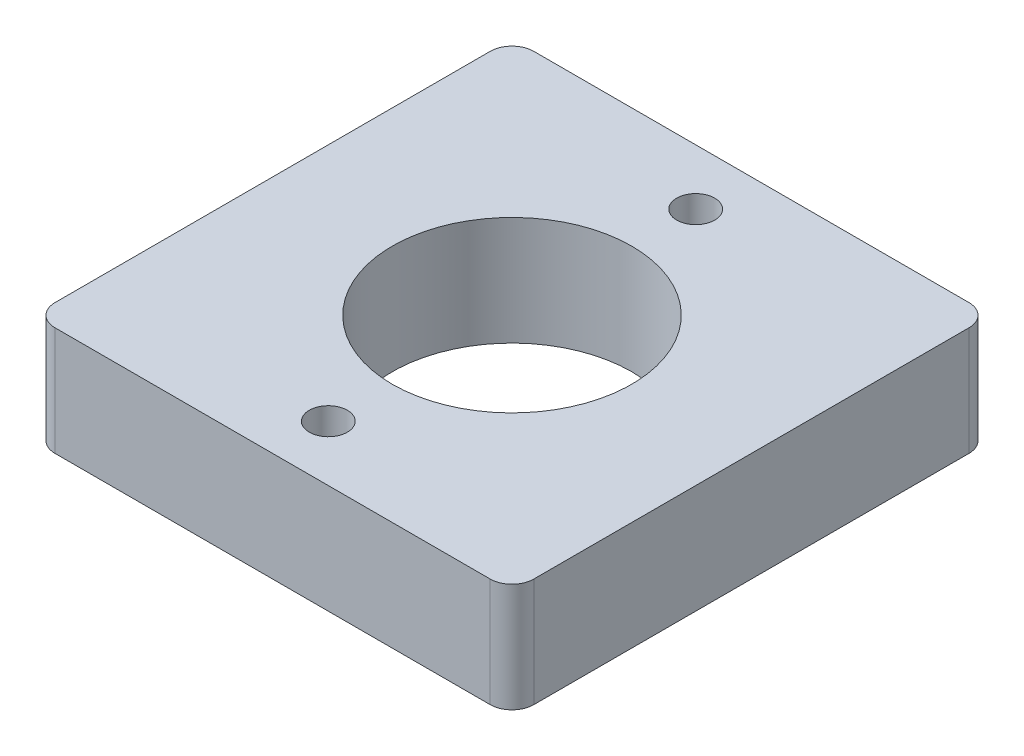
ISO-10303-21;
HEADER;
FILE_DESCRIPTION(('STEP AP214'),'2;1');
FILE_NAME('part.step','',(''),(''),'','','');
FILE_SCHEMA(('AUTOMOTIVE_DESIGN { 1 0 10303 214 1 1 1 1 }'));
ENDSEC;
DATA;
#1=APPLICATION_CONTEXT('core data for automotive mechanical design processes');
#2=APPLICATION_PROTOCOL_DEFINITION('international standard','automotive_design',2000,#1);
#3=PRODUCT_CONTEXT('',#1,'mechanical');
#4=PRODUCT('Part','Part','',(#3));
#5=PRODUCT_RELATED_PRODUCT_CATEGORY('part','',(#4));
#6=PRODUCT_DEFINITION_FORMATION('','',#4);
#7=PRODUCT_DEFINITION_CONTEXT('part definition',#1,'design');
#8=PRODUCT_DEFINITION('design','',#6,#7);
#9=PRODUCT_DEFINITION_SHAPE('','',#8);
#10=(LENGTH_UNIT() NAMED_UNIT(*) SI_UNIT(.MILLI.,.METRE.));
#11=(NAMED_UNIT(*) PLANE_ANGLE_UNIT() SI_UNIT($,.RADIAN.));
#12=(NAMED_UNIT(*) SI_UNIT($,.STERADIAN.) SOLID_ANGLE_UNIT());
#13=UNCERTAINTY_MEASURE_WITH_UNIT(LENGTH_MEASURE(1.E-05),#10,'distance_accuracy_value','');
#14=(GEOMETRIC_REPRESENTATION_CONTEXT(3) GLOBAL_UNCERTAINTY_ASSIGNED_CONTEXT((#13)) GLOBAL_UNIT_ASSIGNED_CONTEXT((#10,
#11,#12)) REPRESENTATION_CONTEXT('',''));
#15=CARTESIAN_POINT('',(0.,0.,0.));
#16=DIRECTION('',(0.,0.,1.));
#17=DIRECTION('',(1.,0.,0.));
#18=AXIS2_PLACEMENT_3D('',#15,#16,#17);
#19=CARTESIAN_POINT('',(0.,10.,0.));
#20=DIRECTION('',(0.,-1.,0.));
#21=DIRECTION('',(0.,0.,-1.));
#22=AXIS2_PLACEMENT_3D('',#19,#20,#21);
#23=PLANE('',#22);
#24=CARTESIAN_POINT('',(0.,10.,-16.88));
#25=DIRECTION('',(0.,1.,0.));
#26=DIRECTION('',(0.,0.,1.));
#27=AXIS2_PLACEMENT_3D('',#24,#25,#26);
#28=CIRCLE('',#27,1.75);
#29=CARTESIAN_POINT('',(0.,10.,-15.13));
#30=VERTEX_POINT('',#29);
#31=EDGE_CURVE('E223',#30,#30,#28,.T.);
#32=ORIENTED_EDGE('',*,*,#31,.F.);
#33=EDGE_LOOP('',(#32));
#34=FACE_BOUND('',#33,.T.);
#35=CARTESIAN_POINT('',(0.,10.,16.88));
#36=DIRECTION('',(0.,1.,0.));
#37=DIRECTION('',(0.,0.,1.));
#38=AXIS2_PLACEMENT_3D('',#35,#36,#37);
#39=CIRCLE('',#38,1.75);
#40=CARTESIAN_POINT('',(0.,10.,18.63));
#41=VERTEX_POINT('',#40);
#42=EDGE_CURVE('E215',#41,#41,#39,.T.);
#43=ORIENTED_EDGE('',*,*,#42,.F.);
#44=EDGE_LOOP('',(#43));
#45=FACE_BOUND('',#44,.T.);
#46=DIRECTION('',(0.,0.,-1.));
#47=VECTOR('',#46,1.);
#48=CARTESIAN_POINT('',(22.,10.,22.));
#49=LINE('',#48,#47);
#50=CARTESIAN_POINT('',(22.,10.,20.));
#51=VERTEX_POINT('',#50);
#52=CARTESIAN_POINT('',(22.,10.,-20.));
#53=VERTEX_POINT('',#52);
#54=EDGE_CURVE('E150',#51,#53,#49,.T.);
#55=ORIENTED_EDGE('',*,*,#54,.T.);
#56=CARTESIAN_POINT('',(20.,10.,-20.));
#57=DIRECTION('',(0.,-1.,0.));
#58=DIRECTION('',(0.,0.,-1.));
#59=AXIS2_PLACEMENT_3D('',#56,#57,#58);
#60=CIRCLE('',#59,2.);
#61=CARTESIAN_POINT('',(20.,10.,-22.));
#62=VERTEX_POINT('',#61);
#63=EDGE_CURVE('E174',#53,#62,#60,.F.);
#64=ORIENTED_EDGE('',*,*,#63,.T.);
#65=DIRECTION('',(-1.,0.,0.));
#66=VECTOR('',#65,1.);
#67=CARTESIAN_POINT('',(-22.,10.,-22.));
#68=LINE('',#67,#66);
#69=CARTESIAN_POINT('',(-20.,10.,-22.));
#70=VERTEX_POINT('',#69);
#71=EDGE_CURVE('E127',#62,#70,#68,.T.);
#72=ORIENTED_EDGE('',*,*,#71,.T.);
#73=CARTESIAN_POINT('',(-20.,10.,-20.));
#74=DIRECTION('',(0.,-1.,0.));
#75=DIRECTION('',(0.,0.,-1.));
#76=AXIS2_PLACEMENT_3D('',#73,#74,#75);
#77=CIRCLE('',#76,2.);
#78=CARTESIAN_POINT('',(-22.,10.,-20.));
#79=VERTEX_POINT('',#78);
#80=EDGE_CURVE('E166',#70,#79,#77,.F.);
#81=ORIENTED_EDGE('',*,*,#80,.T.);
#82=DIRECTION('',(0.,0.,1.));
#83=VECTOR('',#82,1.);
#84=CARTESIAN_POINT('',(-22.,10.,22.));
#85=LINE('',#84,#83);
#86=CARTESIAN_POINT('',(-22.,10.,20.));
#87=VERTEX_POINT('',#86);
#88=EDGE_CURVE('E189',#79,#87,#85,.T.);
#89=ORIENTED_EDGE('',*,*,#88,.T.);
#90=CARTESIAN_POINT('',(-20.,10.,20.));
#91=DIRECTION('',(0.,-1.,0.));
#92=DIRECTION('',(0.,0.,-1.));
#93=AXIS2_PLACEMENT_3D('',#90,#91,#92);
#94=CIRCLE('',#93,2.);
#95=CARTESIAN_POINT('',(-20.,10.,22.));
#96=VERTEX_POINT('',#95);
#97=EDGE_CURVE('E62',#87,#96,#94,.F.);
#98=ORIENTED_EDGE('',*,*,#97,.T.);
#99=DIRECTION('',(1.,0.,0.));
#100=VECTOR('',#99,1.);
#101=CARTESIAN_POINT('',(-22.,10.,22.));
#102=LINE('',#101,#100);
#103=CARTESIAN_POINT('',(20.,10.,22.));
#104=VERTEX_POINT('',#103);
#105=EDGE_CURVE('E152',#96,#104,#102,.T.);
#106=ORIENTED_EDGE('',*,*,#105,.T.);
#107=CARTESIAN_POINT('',(20.,10.,20.));
#108=DIRECTION('',(0.,-1.,0.));
#109=DIRECTION('',(0.,0.,-1.));
#110=AXIS2_PLACEMENT_3D('',#107,#108,#109);
#111=CIRCLE('',#110,2.);
#112=EDGE_CURVE('E171',#104,#51,#111,.F.);
#113=ORIENTED_EDGE('',*,*,#112,.T.);
#114=EDGE_LOOP('',(#55,#64,#72,#81,#89,#98,#106,#113));
#115=FACE_BOUND('',#114,.T.);
#116=CARTESIAN_POINT('',(0.,10.,0.));
#117=DIRECTION('',(0.,1.,0.));
#118=DIRECTION('',(0.,0.,1.));
#119=AXIS2_PLACEMENT_3D('',#116,#117,#118);
#120=CIRCLE('',#119,11.);
#121=CARTESIAN_POINT('',(0.,10.,11.));
#122=VERTEX_POINT('',#121);
#123=EDGE_CURVE('E144',#122,#122,#120,.T.);
#124=ORIENTED_EDGE('',*,*,#123,.F.);
#125=EDGE_LOOP('',(#124));
#126=FACE_BOUND('',#125,.T.);
#127=ADVANCED_FACE('F39',(#34,#45,#115,#126),#23,.F.);
#128=CARTESIAN_POINT('',(0.,0.,0.));
#129=DIRECTION('',(0.,-1.,0.));
#130=DIRECTION('',(0.,0.,-1.));
#131=AXIS2_PLACEMENT_3D('',#128,#129,#130);
#132=PLANE('',#131);
#133=CARTESIAN_POINT('',(0.,0.,-16.88));
#134=DIRECTION('',(0.,1.,0.));
#135=DIRECTION('',(0.,0.,1.));
#136=AXIS2_PLACEMENT_3D('',#133,#134,#135);
#137=CIRCLE('',#136,1.75);
#138=CARTESIAN_POINT('',(0.,0.,-15.13));
#139=VERTEX_POINT('',#138);
#140=EDGE_CURVE('E211',#139,#139,#137,.T.);
#141=ORIENTED_EDGE('',*,*,#140,.T.);
#142=EDGE_LOOP('',(#141));
#143=FACE_BOUND('',#142,.T.);
#144=CARTESIAN_POINT('',(0.,0.,16.88));
#145=DIRECTION('',(0.,1.,0.));
#146=DIRECTION('',(0.,0.,1.));
#147=AXIS2_PLACEMENT_3D('',#144,#145,#146);
#148=CIRCLE('',#147,1.75);
#149=CARTESIAN_POINT('',(0.,0.,18.63));
#150=VERTEX_POINT('',#149);
#151=EDGE_CURVE('E219',#150,#150,#148,.T.);
#152=ORIENTED_EDGE('',*,*,#151,.T.);
#153=EDGE_LOOP('',(#152));
#154=FACE_BOUND('',#153,.T.);
#155=DIRECTION('',(-1.,0.,0.));
#156=VECTOR('',#155,1.);
#157=CARTESIAN_POINT('',(-22.,0.,-22.));
#158=LINE('',#157,#156);
#159=CARTESIAN_POINT('',(20.,0.,-22.));
#160=VERTEX_POINT('',#159);
#161=CARTESIAN_POINT('',(-20.,0.,-22.));
#162=VERTEX_POINT('',#161);
#163=EDGE_CURVE('E124',#160,#162,#158,.T.);
#164=ORIENTED_EDGE('',*,*,#163,.F.);
#165=CARTESIAN_POINT('',(20.,0.,-20.));
#166=DIRECTION('',(0.,-1.,0.));
#167=DIRECTION('',(0.,0.,-1.));
#168=AXIS2_PLACEMENT_3D('',#165,#166,#167);
#169=CIRCLE('',#168,2.);
#170=CARTESIAN_POINT('',(22.,0.,-20.));
#171=VERTEX_POINT('',#170);
#172=EDGE_CURVE('E106',#160,#171,#169,.T.);
#173=ORIENTED_EDGE('',*,*,#172,.T.);
#174=DIRECTION('',(0.,0.,-1.));
#175=VECTOR('',#174,1.);
#176=CARTESIAN_POINT('',(22.,0.,22.));
#177=LINE('',#176,#175);
#178=CARTESIAN_POINT('',(22.,0.,20.));
#179=VERTEX_POINT('',#178);
#180=EDGE_CURVE('E137',#179,#171,#177,.T.);
#181=ORIENTED_EDGE('',*,*,#180,.F.);
#182=CARTESIAN_POINT('',(20.,0.,20.));
#183=DIRECTION('',(0.,-1.,0.));
#184=DIRECTION('',(0.,0.,-1.));
#185=AXIS2_PLACEMENT_3D('',#182,#183,#184);
#186=CIRCLE('',#185,2.);
#187=CARTESIAN_POINT('',(20.,0.,22.));
#188=VERTEX_POINT('',#187);
#189=EDGE_CURVE('E118',#179,#188,#186,.T.);
#190=ORIENTED_EDGE('',*,*,#189,.T.);
#191=DIRECTION('',(1.,0.,0.));
#192=VECTOR('',#191,1.);
#193=CARTESIAN_POINT('',(-22.,0.,22.));
#194=LINE('',#193,#192);
#195=CARTESIAN_POINT('',(-20.,0.,22.));
#196=VERTEX_POINT('',#195);
#197=EDGE_CURVE('E142',#196,#188,#194,.T.);
#198=ORIENTED_EDGE('',*,*,#197,.F.);
#199=CARTESIAN_POINT('',(-20.,0.,20.));
#200=DIRECTION('',(0.,-1.,0.));
#201=DIRECTION('',(0.,0.,-1.));
#202=AXIS2_PLACEMENT_3D('',#199,#200,#201);
#203=CIRCLE('',#202,2.);
#204=CARTESIAN_POINT('',(-22.,0.,20.));
#205=VERTEX_POINT('',#204);
#206=EDGE_CURVE('E156',#196,#205,#203,.T.);
#207=ORIENTED_EDGE('',*,*,#206,.T.);
#208=DIRECTION('',(0.,0.,1.));
#209=VECTOR('',#208,1.);
#210=CARTESIAN_POINT('',(-22.,0.,22.));
#211=LINE('',#210,#209);
#212=CARTESIAN_POINT('',(-22.,0.,-20.));
#213=VERTEX_POINT('',#212);
#214=EDGE_CURVE('E136',#213,#205,#211,.T.);
#215=ORIENTED_EDGE('',*,*,#214,.F.);
#216=CARTESIAN_POINT('',(-20.,0.,-20.));
#217=DIRECTION('',(0.,-1.,0.));
#218=DIRECTION('',(0.,0.,-1.));
#219=AXIS2_PLACEMENT_3D('',#216,#217,#218);
#220=CIRCLE('',#219,2.);
#221=EDGE_CURVE('E129',#213,#162,#220,.T.);
#222=ORIENTED_EDGE('',*,*,#221,.T.);
#223=EDGE_LOOP('',(#164,#173,#181,#190,#198,#207,#215,#222));
#224=FACE_BOUND('',#223,.T.);
#225=CARTESIAN_POINT('',(0.,0.,0.));
#226=DIRECTION('',(0.,1.,0.));
#227=DIRECTION('',(0.,0.,1.));
#228=AXIS2_PLACEMENT_3D('',#225,#226,#227);
#229=CIRCLE('',#228,11.);
#230=CARTESIAN_POINT('',(0.,0.,11.));
#231=VERTEX_POINT('',#230);
#232=EDGE_CURVE('E207',#231,#231,#229,.T.);
#233=ORIENTED_EDGE('',*,*,#232,.T.);
#234=EDGE_LOOP('',(#233));
#235=FACE_BOUND('',#234,.T.);
#236=ADVANCED_FACE('F132',(#143,#154,#224,#235),#132,.T.);
#237=CARTESIAN_POINT('',(22.,10.,22.));
#238=DIRECTION('',(-1.,0.,0.));
#239=DIRECTION('',(0.,0.,1.));
#240=AXIS2_PLACEMENT_3D('',#237,#238,#239);
#241=PLANE('',#240);
#242=ORIENTED_EDGE('',*,*,#180,.T.);
#243=DIRECTION('',(0.,-1.,0.));
#244=VECTOR('',#243,1.);
#245=CARTESIAN_POINT('',(22.,10.,-20.));
#246=LINE('',#245,#244);
#247=EDGE_CURVE('E111',#171,#53,#246,.F.);
#248=ORIENTED_EDGE('',*,*,#247,.T.);
#249=ORIENTED_EDGE('',*,*,#54,.F.);
#250=DIRECTION('',(0.,-1.,0.));
#251=VECTOR('',#250,1.);
#252=CARTESIAN_POINT('',(22.,10.,20.));
#253=LINE('',#252,#251);
#254=EDGE_CURVE('E117',#51,#179,#253,.T.);
#255=ORIENTED_EDGE('',*,*,#254,.T.);
#256=EDGE_LOOP('',(#242,#248,#249,#255));
#257=FACE_BOUND('',#256,.T.);
#258=ADVANCED_FACE('F254',(#257),#241,.F.);
#259=CARTESIAN_POINT('',(-22.,10.,-22.));
#260=DIRECTION('',(0.,0.,1.));
#261=DIRECTION('',(1.,0.,0.));
#262=AXIS2_PLACEMENT_3D('',#259,#260,#261);
#263=PLANE('',#262);
#264=ORIENTED_EDGE('',*,*,#71,.F.);
#265=DIRECTION('',(0.,-1.,0.));
#266=VECTOR('',#265,1.);
#267=CARTESIAN_POINT('',(20.,10.,-22.));
#268=LINE('',#267,#266);
#269=EDGE_CURVE('E110',#62,#160,#268,.T.);
#270=ORIENTED_EDGE('',*,*,#269,.T.);
#271=ORIENTED_EDGE('',*,*,#163,.T.);
#272=DIRECTION('',(0.,-1.,0.));
#273=VECTOR('',#272,1.);
#274=CARTESIAN_POINT('',(-20.,10.,-22.));
#275=LINE('',#274,#273);
#276=EDGE_CURVE('E130',#162,#70,#275,.F.);
#277=ORIENTED_EDGE('',*,*,#276,.T.);
#278=EDGE_LOOP('',(#264,#270,#271,#277));
#279=FACE_BOUND('',#278,.T.);
#280=ADVANCED_FACE('F123',(#279),#263,.F.);
#281=CARTESIAN_POINT('',(-22.,10.,22.));
#282=DIRECTION('',(1.,0.,0.));
#283=DIRECTION('',(0.,0.,-1.));
#284=AXIS2_PLACEMENT_3D('',#281,#282,#283);
#285=PLANE('',#284);
#286=ORIENTED_EDGE('',*,*,#214,.T.);
#287=DIRECTION('',(0.,-1.,0.));
#288=VECTOR('',#287,1.);
#289=CARTESIAN_POINT('',(-22.,10.,20.));
#290=LINE('',#289,#288);
#291=EDGE_CURVE('E11',#205,#87,#290,.F.);
#292=ORIENTED_EDGE('',*,*,#291,.T.);
#293=ORIENTED_EDGE('',*,*,#88,.F.);
#294=DIRECTION('',(0.,-1.,0.));
#295=VECTOR('',#294,1.);
#296=CARTESIAN_POINT('',(-22.,10.,-20.));
#297=LINE('',#296,#295);
#298=EDGE_CURVE('E48',#79,#213,#297,.T.);
#299=ORIENTED_EDGE('',*,*,#298,.T.);
#300=EDGE_LOOP('',(#286,#292,#293,#299));
#301=FACE_BOUND('',#300,.T.);
#302=ADVANCED_FACE('F187',(#301),#285,.F.);
#303=CARTESIAN_POINT('',(-22.,10.,22.));
#304=DIRECTION('',(0.,0.,-1.));
#305=DIRECTION('',(-1.,0.,0.));
#306=AXIS2_PLACEMENT_3D('',#303,#304,#305);
#307=PLANE('',#306);
#308=ORIENTED_EDGE('',*,*,#197,.T.);
#309=DIRECTION('',(0.,-1.,0.));
#310=VECTOR('',#309,1.);
#311=CARTESIAN_POINT('',(20.,10.,22.));
#312=LINE('',#311,#310);
#313=EDGE_CURVE('E55',#188,#104,#312,.F.);
#314=ORIENTED_EDGE('',*,*,#313,.T.);
#315=ORIENTED_EDGE('',*,*,#105,.F.);
#316=DIRECTION('',(0.,-1.,0.));
#317=VECTOR('',#316,1.);
#318=CARTESIAN_POINT('',(-20.,10.,22.));
#319=LINE('',#318,#317);
#320=EDGE_CURVE('E177',#96,#196,#319,.T.);
#321=ORIENTED_EDGE('',*,*,#320,.T.);
#322=EDGE_LOOP('',(#308,#314,#315,#321));
#323=FACE_BOUND('',#322,.T.);
#324=ADVANCED_FACE('F196',(#323),#307,.F.);
#325=CARTESIAN_POINT('',(0.,10.,0.));
#326=DIRECTION('',(0.,-1.,0.));
#327=DIRECTION('',(0.,0.,-1.));
#328=AXIS2_PLACEMENT_3D('',#325,#326,#327);
#329=CYLINDRICAL_SURFACE('',#328,11.);
#330=ORIENTED_EDGE('',*,*,#123,.T.);
#331=EDGE_LOOP('',(#330));
#332=FACE_BOUND('',#331,.T.);
#333=ORIENTED_EDGE('',*,*,#232,.F.);
#334=EDGE_LOOP('',(#333));
#335=FACE_BOUND('',#334,.T.);
#336=ADVANCED_FACE('F248',(#332,#335),#329,.F.);
#337=CARTESIAN_POINT('',(0.,0.,16.88));
#338=DIRECTION('',(0.,1.,0.));
#339=DIRECTION('',(0.,0.,1.));
#340=AXIS2_PLACEMENT_3D('',#337,#338,#339);
#341=CYLINDRICAL_SURFACE('',#340,1.75);
#342=ORIENTED_EDGE('',*,*,#151,.F.);
#343=EDGE_LOOP('',(#342));
#344=FACE_BOUND('',#343,.T.);
#345=ORIENTED_EDGE('',*,*,#42,.T.);
#346=EDGE_LOOP('',(#345));
#347=FACE_BOUND('',#346,.T.);
#348=ADVANCED_FACE('F236',(#344,#347),#341,.F.);
#349=CARTESIAN_POINT('',(0.,0.,-16.88));
#350=DIRECTION('',(0.,1.,0.));
#351=DIRECTION('',(0.,0.,1.));
#352=AXIS2_PLACEMENT_3D('',#349,#350,#351);
#353=CYLINDRICAL_SURFACE('',#352,1.75);
#354=ORIENTED_EDGE('',*,*,#140,.F.);
#355=EDGE_LOOP('',(#354));
#356=FACE_BOUND('',#355,.T.);
#357=ORIENTED_EDGE('',*,*,#31,.T.);
#358=EDGE_LOOP('',(#357));
#359=FACE_BOUND('',#358,.T.);
#360=ADVANCED_FACE('F233',(#356,#359),#353,.F.);
#361=CARTESIAN_POINT('',(20.,10.,-20.));
#362=DIRECTION('',(0.,-1.,0.));
#363=DIRECTION('',(0.,0.,-1.));
#364=AXIS2_PLACEMENT_3D('',#361,#362,#363);
#365=CYLINDRICAL_SURFACE('',#364,2.);
#366=ORIENTED_EDGE('',*,*,#63,.F.);
#367=ORIENTED_EDGE('',*,*,#247,.F.);
#368=ORIENTED_EDGE('',*,*,#172,.F.);
#369=ORIENTED_EDGE('',*,*,#269,.F.);
#370=EDGE_LOOP('',(#366,#367,#368,#369));
#371=FACE_BOUND('',#370,.T.);
#372=ADVANCED_FACE('F109',(#371),#365,.T.);
#373=CARTESIAN_POINT('',(20.,10.,20.));
#374=DIRECTION('',(0.,-1.,0.));
#375=DIRECTION('',(0.,0.,-1.));
#376=AXIS2_PLACEMENT_3D('',#373,#374,#375);
#377=CYLINDRICAL_SURFACE('',#376,2.);
#378=ORIENTED_EDGE('',*,*,#112,.F.);
#379=ORIENTED_EDGE('',*,*,#313,.F.);
#380=ORIENTED_EDGE('',*,*,#189,.F.);
#381=ORIENTED_EDGE('',*,*,#254,.F.);
#382=EDGE_LOOP('',(#378,#379,#380,#381));
#383=FACE_BOUND('',#382,.T.);
#384=ADVANCED_FACE('F270',(#383),#377,.T.);
#385=CARTESIAN_POINT('',(-20.,10.,20.));
#386=DIRECTION('',(0.,-1.,0.));
#387=DIRECTION('',(0.,0.,-1.));
#388=AXIS2_PLACEMENT_3D('',#385,#386,#387);
#389=CYLINDRICAL_SURFACE('',#388,2.);
#390=ORIENTED_EDGE('',*,*,#97,.F.);
#391=ORIENTED_EDGE('',*,*,#291,.F.);
#392=ORIENTED_EDGE('',*,*,#206,.F.);
#393=ORIENTED_EDGE('',*,*,#320,.F.);
#394=EDGE_LOOP('',(#390,#391,#392,#393));
#395=FACE_BOUND('',#394,.T.);
#396=ADVANCED_FACE('F195',(#395),#389,.T.);
#397=CARTESIAN_POINT('',(-20.,10.,-20.));
#398=DIRECTION('',(0.,-1.,0.));
#399=DIRECTION('',(0.,0.,-1.));
#400=AXIS2_PLACEMENT_3D('',#397,#398,#399);
#401=CYLINDRICAL_SURFACE('',#400,2.);
#402=ORIENTED_EDGE('',*,*,#80,.F.);
#403=ORIENTED_EDGE('',*,*,#276,.F.);
#404=ORIENTED_EDGE('',*,*,#221,.F.);
#405=ORIENTED_EDGE('',*,*,#298,.F.);
#406=EDGE_LOOP('',(#402,#403,#404,#405));
#407=FACE_BOUND('',#406,.T.);
#408=ADVANCED_FACE('F41',(#407),#401,.T.);
#409=CLOSED_SHELL('',(#127,#236,#258,#280,#302,#324,#336,#348,#360,#372,#384,#396,#408));
#410=MANIFOLD_SOLID_BREP('B2',#409);
#411=ADVANCED_BREP_SHAPE_REPRESENTATION('',(#18,#410),#14);
#412=SHAPE_DEFINITION_REPRESENTATION(#9,#411);
ENDSEC;
END-ISO-10303-21;
